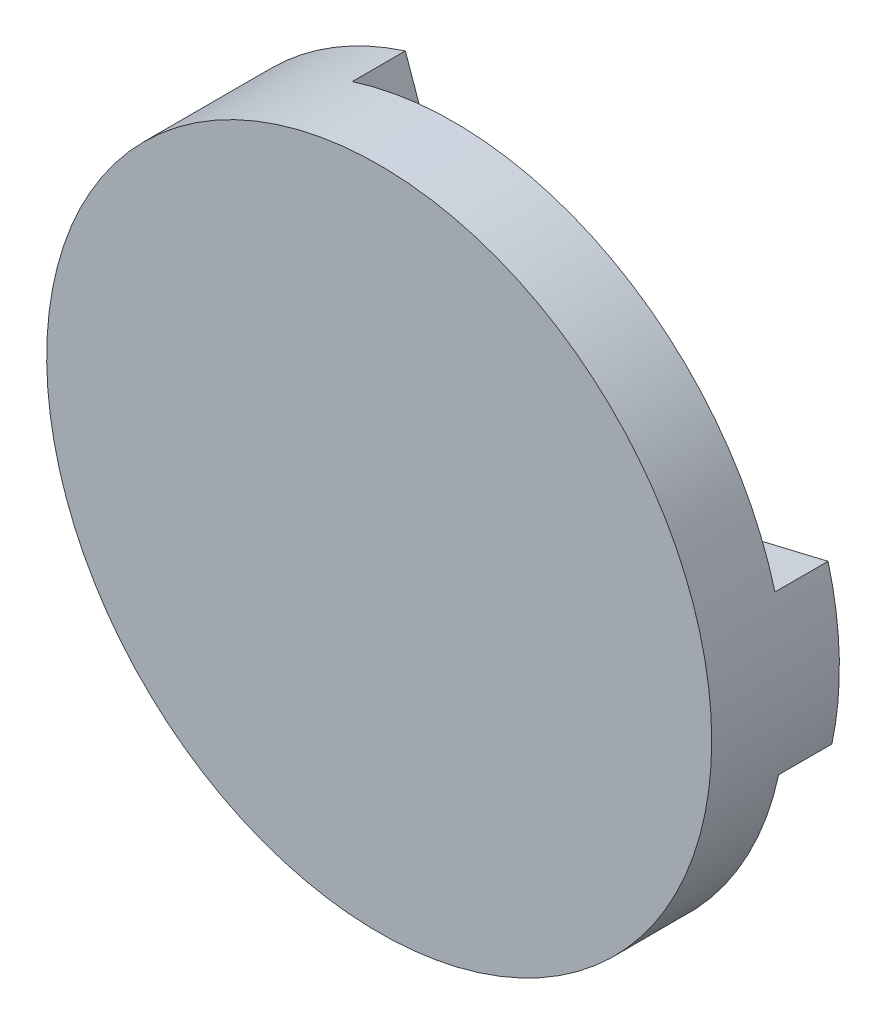
ISO-10303-21;
HEADER;
FILE_DESCRIPTION(('STEP AP214'),'2;1');
FILE_NAME('part.step','',(''),(''),'','','');
FILE_SCHEMA(('AUTOMOTIVE_DESIGN { 1 0 10303 214 1 1 1 1 }'));
ENDSEC;
DATA;
#1=APPLICATION_CONTEXT('core data for automotive mechanical design processes');
#2=APPLICATION_PROTOCOL_DEFINITION('international standard','automotive_design',2000,#1);
#3=PRODUCT_CONTEXT('',#1,'mechanical');
#4=PRODUCT('Part','Part','',(#3));
#5=PRODUCT_RELATED_PRODUCT_CATEGORY('part','',(#4));
#6=PRODUCT_DEFINITION_FORMATION('','',#4);
#7=PRODUCT_DEFINITION_CONTEXT('part definition',#1,'design');
#8=PRODUCT_DEFINITION('design','',#6,#7);
#9=PRODUCT_DEFINITION_SHAPE('','',#8);
#10=(LENGTH_UNIT() NAMED_UNIT(*) SI_UNIT(.MILLI.,.METRE.));
#11=(NAMED_UNIT(*) PLANE_ANGLE_UNIT() SI_UNIT($,.RADIAN.));
#12=(NAMED_UNIT(*) SI_UNIT($,.STERADIAN.) SOLID_ANGLE_UNIT());
#13=UNCERTAINTY_MEASURE_WITH_UNIT(LENGTH_MEASURE(1.E-05),#10,'distance_accuracy_value','');
#14=(GEOMETRIC_REPRESENTATION_CONTEXT(3) GLOBAL_UNCERTAINTY_ASSIGNED_CONTEXT((#13)) GLOBAL_UNIT_ASSIGNED_CONTEXT((#10,
#11,#12)) REPRESENTATION_CONTEXT('',''));
#15=CARTESIAN_POINT('',(0.,0.,0.));
#16=DIRECTION('',(0.,0.,1.));
#17=DIRECTION('',(1.,0.,0.));
#18=AXIS2_PLACEMENT_3D('',#15,#16,#17);
#19=CARTESIAN_POINT('',(-49.5057986834796,-44.6279443938459,12.7));
#20=DIRECTION('',(0.,0.,1.));
#21=DIRECTION('',(1.,0.,0.));
#22=AXIS2_PLACEMENT_3D('',#19,#20,#21);
#23=PLANE('',#22);
#24=CARTESIAN_POINT('',(-49.5057986834796,-44.6279443938459,12.7));
#25=DIRECTION('',(0.,0.,1.));
#26=DIRECTION('',(-1.,0.,0.));
#27=AXIS2_PLACEMENT_3D('',#24,#25,#26);
#28=CIRCLE('',#27,35.1808297096941);
#29=CARTESIAN_POINT('',(-58.6049963833806,-78.611696103753,12.7));
#30=VERTEX_POINT('',#29);
#31=CARTESIAN_POINT('',(-15.1256173713138,-52.0907797802859,12.7));
#32=VERTEX_POINT('',#31);
#33=EDGE_CURVE('E240',#30,#32,#28,.T.);
#34=ORIENTED_EDGE('',*,*,#33,.F.);
#35=DIRECTION('',(0.285993671395567,0.958231506433432,0.));
#36=VECTOR('',#35,1.);
#37=CARTESIAN_POINT('',(-58.7480502112232,-79.0910028110861,12.7));
#38=LINE('',#37,#36);
#39=CARTESIAN_POINT('',(-51.6290126964686,-55.2384259032424,12.7));
#40=VERTEX_POINT('',#39);
#41=EDGE_CURVE('E343',#30,#40,#38,.T.);
#42=ORIENTED_EDGE('',*,*,#41,.T.);
#43=CARTESIAN_POINT('',(-49.5057986834796,-44.6279443938459,12.7));
#44=DIRECTION('',(0.,0.,1.));
#45=DIRECTION('',(1.,0.,0.));
#46=AXIS2_PLACEMENT_3D('',#43,#44,#45);
#47=CIRCLE('',#46,10.8208297096941);
#48=CARTESIAN_POINT('',(-57.2792506996545,-52.1554804687129,12.7));
#49=VERTEX_POINT('',#48);
#50=EDGE_CURVE('E353',#49,#40,#47,.T.);
#51=ORIENTED_EDGE('',*,*,#50,.F.);
#52=DIRECTION('',(-0.651016085634153,-0.759063934227931,0.));
#53=VECTOR('',#52,1.);
#54=CARTESIAN_POINT('',(-57.2792506996545,-52.1554804687129,12.7));
#55=LINE('',#54,#53);
#56=CARTESIAN_POINT('',(-73.1588943684811,-70.6706371036764,12.7));
#57=VERTEX_POINT('',#56);
#58=EDGE_CURVE('E338',#49,#57,#55,.T.);
#59=ORIENTED_EDGE('',*,*,#58,.T.);
#60=CARTESIAN_POINT('',(-49.5057986834796,-44.6279443938459,12.7));
#61=DIRECTION('',(0.,0.,1.));
#62=DIRECTION('',(-1.,0.,0.));
#63=AXIS2_PLACEMENT_3D('',#60,#61,#62);
#64=CIRCLE('',#63,35.1808297096941);
#65=CARTESIAN_POINT('',(-74.3869921302117,-19.7559321767214,12.7));
#66=VERTEX_POINT('',#65);
#67=EDGE_CURVE('E290',#66,#57,#64,.T.);
#68=ORIENTED_EDGE('',*,*,#67,.F.);
#69=DIRECTION('',(0.686855991580207,-0.72679353796685,0.));
#70=VECTOR('',#69,1.);
#71=CARTESIAN_POINT('',(-74.7305570010451,-19.3923905740346,12.7));
#72=LINE('',#71,#70);
#73=CARTESIAN_POINT('',(-57.6331382105075,-37.4839463662281,12.7));
#74=VERTEX_POINT('',#73);
#75=EDGE_CURVE('E456',#66,#74,#72,.T.);
#76=ORIENTED_EDGE('',*,*,#75,.T.);
#77=CARTESIAN_POINT('',(-49.5057986834796,-44.6279443938459,12.7));
#78=DIRECTION('',(0.,0.,1.));
#79=DIRECTION('',(1.,0.,0.));
#80=AXIS2_PLACEMENT_3D('',#77,#78,#79);
#81=CIRCLE('',#80,10.8208297096941);
#82=CARTESIAN_POINT('',(-52.1381101441308,-34.1321694353056,12.7));
#83=VERTEX_POINT('',#82);
#84=EDGE_CURVE('E444',#83,#74,#81,.T.);
#85=ORIENTED_EDGE('',*,*,#84,.F.);
#86=DIRECTION('',(-0.331860607320881,0.943328435545445,0.));
#87=VECTOR('',#86,1.);
#88=CARTESIAN_POINT('',(-52.1381101441308,-34.1321694353056,12.7));
#89=LINE('',#88,#87);
#90=CARTESIAN_POINT('',(-60.2328843106441,-11.1224162975754,12.7));
#91=VERTEX_POINT('',#90);
#92=EDGE_CURVE('E434',#83,#91,#89,.T.);
#93=ORIENTED_EDGE('',*,*,#92,.T.);
#94=CARTESIAN_POINT('',(-49.5057986834796,-44.6279443938459,12.7));
#95=DIRECTION('',(0.,0.,1.));
#96=DIRECTION('',(-1.,0.,0.));
#97=AXIS2_PLACEMENT_3D('',#94,#95,#96);
#98=CIRCLE('',#97,35.1808297096941);
#99=CARTESIAN_POINT('',(-15.5254075368467,-35.5162049010634,12.7));
#100=VERTEX_POINT('',#99);
#101=EDGE_CURVE('E350',#100,#91,#98,.T.);
#102=ORIENTED_EDGE('',*,*,#101,.F.);
#103=DIRECTION('',(-0.972849662975767,-0.231437968466579,0.));
#104=VECTOR('',#103,1.);
#105=CARTESIAN_POINT('',(-15.0387888381707,-35.4004397964172,12.7));
#106=LINE('',#105,#104);
#107=CARTESIAN_POINT('',(-39.2552451434626,-41.1614609120673,12.7));
#108=VERTEX_POINT('',#107);
#109=EDGE_CURVE('E466',#100,#108,#106,.T.);
#110=ORIENTED_EDGE('',*,*,#109,.T.);
#111=CARTESIAN_POINT('',(-49.5057986834796,-44.6279443938459,12.7));
#112=DIRECTION('',(0.,0.,1.));
#113=DIRECTION('',(1.,0.,0.));
#114=AXIS2_PLACEMENT_3D('',#111,#112,#113);
#115=CIRCLE('',#114,10.8208297096941);
#116=CARTESIAN_POINT('',(-39.1000352066535,-47.5961832775193,12.7));
#117=VERTEX_POINT('',#116);
#118=EDGE_CURVE('E463',#117,#108,#115,.T.);
#119=ORIENTED_EDGE('',*,*,#118,.F.);
#120=DIRECTION('',(0.982876692955026,-0.184264501317512,0.));
#121=VECTOR('',#120,1.);
#122=CARTESIAN_POINT('',(-39.1000352066535,-47.5961832775193,12.7));
#123=LINE('',#122,#121);
#124=EDGE_CURVE('E266',#117,#32,#123,.T.);
#125=ORIENTED_EDGE('',*,*,#124,.T.);
#126=EDGE_LOOP('',(#34,#42,#51,#59,#68,#76,#85,#93,#102,#110,#119,#125));
#127=FACE_BOUND('',#126,.T.);
#128=ADVANCED_FACE('F37',(#127),#23,.F.);
#129=CARTESIAN_POINT('',(-39.1000352066535,-47.5961832775193,12.7));
#130=DIRECTION('',(0.184264501317512,0.982876692955026,0.));
#131=DIRECTION('',(-0.982876692955026,0.184264501317512,0.));
#132=AXIS2_PLACEMENT_3D('',#129,#130,#131);
#133=PLANE('',#132);
#134=DIRECTION('',(0.,0.,1.));
#135=VECTOR('',#134,1.);
#136=CARTESIAN_POINT('',(-15.1256173713138,-52.0907797802859,5.7));
#137=LINE('',#136,#135);
#138=CARTESIAN_POINT('',(-15.1256173713138,-52.0907797802859,5.7));
#139=VERTEX_POINT('',#138);
#140=EDGE_CURVE('E239',#32,#139,#137,.F.);
#141=ORIENTED_EDGE('',*,*,#140,.F.);
#142=ORIENTED_EDGE('',*,*,#124,.F.);
#143=DIRECTION('',(0.,0.,-1.));
#144=VECTOR('',#143,1.);
#145=CARTESIAN_POINT('',(-39.1000352066535,-47.5961832775193,12.7));
#146=LINE('',#145,#144);
#147=CARTESIAN_POINT('',(-39.1000352066535,-47.5961832775193,0.));
#148=VERTEX_POINT('',#147);
#149=EDGE_CURVE('E256',#117,#148,#146,.T.);
#150=ORIENTED_EDGE('',*,*,#149,.T.);
#151=DIRECTION('',(0.982876692955026,-0.184264501317512,0.));
#152=VECTOR('',#151,1.);
#153=CARTESIAN_POINT('',(-39.1000352066535,-47.5961832775193,0.));
#154=LINE('',#153,#152);
#155=CARTESIAN_POINT('',(-14.6339831594852,-52.1829487507403,0.));
#156=VERTEX_POINT('',#155);
#157=EDGE_CURVE('E254',#148,#156,#154,.T.);
#158=ORIENTED_EDGE('',*,*,#157,.T.);
#159=DIRECTION('',(0.,0.,-1.));
#160=VECTOR('',#159,1.);
#161=CARTESIAN_POINT('',(-14.6339831594852,-52.1829487507403,12.7));
#162=LINE('',#161,#160);
#163=CARTESIAN_POINT('',(-14.6339831594852,-52.1829487507403,5.7));
#164=VERTEX_POINT('',#163);
#165=EDGE_CURVE('E247',#164,#156,#162,.T.);
#166=ORIENTED_EDGE('',*,*,#165,.F.);
#167=DIRECTION('',(-0.982876692955026,0.184264501317512,0.));
#168=VECTOR('',#167,1.);
#169=CARTESIAN_POINT('',(-39.1000352066535,-47.5961832775193,5.7));
#170=LINE('',#169,#168);
#171=EDGE_CURVE('E232',#164,#139,#170,.T.);
#172=ORIENTED_EDGE('',*,*,#171,.T.);
#173=EDGE_LOOP('',(#141,#142,#150,#158,#166,#172));
#174=FACE_BOUND('',#173,.T.);
#175=ADVANCED_FACE('F252',(#174),#133,.F.);
#176=CARTESIAN_POINT('',(-58.7480502112232,-79.0910028110861,12.7));
#177=DIRECTION('',(-0.958231506433432,0.285993671395567,0.));
#178=DIRECTION('',(-0.285993671395567,-0.958231506433432,0.));
#179=AXIS2_PLACEMENT_3D('',#176,#177,#178);
#180=PLANE('',#179);
#181=DIRECTION('',(0.,0.,1.));
#182=VECTOR('',#181,1.);
#183=CARTESIAN_POINT('',(-58.6049963833806,-78.611696103753,5.7));
#184=LINE('',#183,#182);
#185=CARTESIAN_POINT('',(-58.6049963833806,-78.611696103753,5.7));
#186=VERTEX_POINT('',#185);
#187=EDGE_CURVE('E11',#186,#30,#184,.T.);
#188=ORIENTED_EDGE('',*,*,#187,.F.);
#189=DIRECTION('',(-0.285993671395567,-0.958231506433432,0.));
#190=VECTOR('',#189,1.);
#191=CARTESIAN_POINT('',(-58.7480502112232,-79.0910028110861,5.7));
#192=LINE('',#191,#190);
#193=CARTESIAN_POINT('',(-58.7480502112232,-79.0910028110861,5.7));
#194=VERTEX_POINT('',#193);
#195=EDGE_CURVE('E45',#186,#194,#192,.T.);
#196=ORIENTED_EDGE('',*,*,#195,.T.);
#197=DIRECTION('',(0.,0.,-1.));
#198=VECTOR('',#197,1.);
#199=CARTESIAN_POINT('',(-58.7480502112232,-79.0910028110861,12.7));
#200=LINE('',#199,#198);
#201=CARTESIAN_POINT('',(-58.7480502112232,-79.0910028110861,0.));
#202=VERTEX_POINT('',#201);
#203=EDGE_CURVE('E250',#194,#202,#200,.T.);
#204=ORIENTED_EDGE('',*,*,#203,.T.);
#205=DIRECTION('',(0.285993671395567,0.958231506433432,0.));
#206=VECTOR('',#205,1.);
#207=CARTESIAN_POINT('',(-58.7480502112232,-79.0910028110861,0.));
#208=LINE('',#207,#206);
#209=CARTESIAN_POINT('',(-51.6290126964686,-55.2384259032424,0.));
#210=VERTEX_POINT('',#209);
#211=EDGE_CURVE('E346',#202,#210,#208,.T.);
#212=ORIENTED_EDGE('',*,*,#211,.T.);
#213=DIRECTION('',(0.,0.,-1.));
#214=VECTOR('',#213,1.);
#215=CARTESIAN_POINT('',(-51.6290126964686,-55.2384259032424,12.7));
#216=LINE('',#215,#214);
#217=EDGE_CURVE('E332',#40,#210,#216,.T.);
#218=ORIENTED_EDGE('',*,*,#217,.F.);
#219=ORIENTED_EDGE('',*,*,#41,.F.);
#220=EDGE_LOOP('',(#188,#196,#204,#212,#218,#219));
#221=FACE_BOUND('',#220,.T.);
#222=ADVANCED_FACE('F278',(#221),#180,.F.);
#223=CARTESIAN_POINT('',(-74.7305570010451,-19.3923905740346,12.7));
#224=DIRECTION('',(0.72679353796685,0.686855991580207,0.));
#225=DIRECTION('',(-0.686855991580207,0.72679353796685,0.));
#226=AXIS2_PLACEMENT_3D('',#223,#224,#225);
#227=PLANE('',#226);
#228=DIRECTION('',(0.,0.,1.));
#229=VECTOR('',#228,1.);
#230=CARTESIAN_POINT('',(-74.3869921302117,-19.7559321767214,5.7));
#231=LINE('',#230,#229);
#232=CARTESIAN_POINT('',(-74.3869921302117,-19.7559321767214,5.7));
#233=VERTEX_POINT('',#232);
#234=EDGE_CURVE('E297',#233,#66,#231,.T.);
#235=ORIENTED_EDGE('',*,*,#234,.F.);
#236=DIRECTION('',(-0.686855991580207,0.72679353796685,0.));
#237=VECTOR('',#236,1.);
#238=CARTESIAN_POINT('',(-74.7305570010451,-19.3923905740346,5.7));
#239=LINE('',#238,#237);
#240=CARTESIAN_POINT('',(-74.7305570010451,-19.3923905740345,5.7));
#241=VERTEX_POINT('',#240);
#242=EDGE_CURVE('E292',#233,#241,#239,.T.);
#243=ORIENTED_EDGE('',*,*,#242,.T.);
#244=DIRECTION('',(0.,0.,-1.));
#245=VECTOR('',#244,1.);
#246=CARTESIAN_POINT('',(-74.7305570010451,-19.3923905740346,12.7));
#247=LINE('',#246,#245);
#248=CARTESIAN_POINT('',(-74.7305570010451,-19.3923905740346,0.));
#249=VERTEX_POINT('',#248);
#250=EDGE_CURVE('E435',#241,#249,#247,.T.);
#251=ORIENTED_EDGE('',*,*,#250,.T.);
#252=DIRECTION('',(0.686855991580207,-0.72679353796685,0.));
#253=VECTOR('',#252,1.);
#254=CARTESIAN_POINT('',(-74.7305570010451,-19.3923905740346,0.));
#255=LINE('',#254,#253);
#256=CARTESIAN_POINT('',(-57.6331382105075,-37.4839463662281,0.));
#257=VERTEX_POINT('',#256);
#258=EDGE_CURVE('E447',#249,#257,#255,.T.);
#259=ORIENTED_EDGE('',*,*,#258,.T.);
#260=DIRECTION('',(0.,0.,-1.));
#261=VECTOR('',#260,1.);
#262=CARTESIAN_POINT('',(-57.6331382105075,-37.4839463662281,12.7));
#263=LINE('',#262,#261);
#264=EDGE_CURVE('E432',#74,#257,#263,.T.);
#265=ORIENTED_EDGE('',*,*,#264,.F.);
#266=ORIENTED_EDGE('',*,*,#75,.F.);
#267=EDGE_LOOP('',(#235,#243,#251,#259,#265,#266));
#268=FACE_BOUND('',#267,.T.);
#269=ADVANCED_FACE('F509',(#268),#227,.F.);
#270=CARTESIAN_POINT('',(-57.2792506996545,-52.1554804687129,12.7));
#271=DIRECTION('',(0.759063934227931,-0.651016085634153,0.));
#272=DIRECTION('',(0.651016085634153,0.759063934227931,0.));
#273=AXIS2_PLACEMENT_3D('',#270,#271,#272);
#274=PLANE('',#273);
#275=DIRECTION('',(0.,0.,1.));
#276=VECTOR('',#275,1.);
#277=CARTESIAN_POINT('',(-73.1588943684811,-70.6706371036764,5.7));
#278=LINE('',#277,#276);
#279=CARTESIAN_POINT('',(-73.1588943684811,-70.6706371036764,5.7));
#280=VERTEX_POINT('',#279);
#281=EDGE_CURVE('E275',#57,#280,#278,.F.);
#282=ORIENTED_EDGE('',*,*,#281,.F.);
#283=ORIENTED_EDGE('',*,*,#58,.F.);
#284=DIRECTION('',(0.,0.,-1.));
#285=VECTOR('',#284,1.);
#286=CARTESIAN_POINT('',(-57.2792506996545,-52.1554804687129,12.7));
#287=LINE('',#286,#285);
#288=CARTESIAN_POINT('',(-57.2792506996545,-52.1554804687129,0.));
#289=VERTEX_POINT('',#288);
#290=EDGE_CURVE('E334',#49,#289,#287,.T.);
#291=ORIENTED_EDGE('',*,*,#290,.T.);
#292=DIRECTION('',(-0.651016085634153,-0.759063934227931,0.));
#293=VECTOR('',#292,1.);
#294=CARTESIAN_POINT('',(-57.2792506996545,-52.1554804687129,0.));
#295=LINE('',#294,#293);
#296=CARTESIAN_POINT('',(-73.4845321442495,-71.0503203352623,0.));
#297=VERTEX_POINT('',#296);
#298=EDGE_CURVE('E339',#289,#297,#295,.T.);
#299=ORIENTED_EDGE('',*,*,#298,.T.);
#300=DIRECTION('',(0.,0.,-1.));
#301=VECTOR('',#300,1.);
#302=CARTESIAN_POINT('',(-73.4845321442495,-71.0503203352623,12.7));
#303=LINE('',#302,#301);
#304=CARTESIAN_POINT('',(-73.4845321442495,-71.0503203352623,5.7));
#305=VERTEX_POINT('',#304);
#306=EDGE_CURVE('E336',#305,#297,#303,.T.);
#307=ORIENTED_EDGE('',*,*,#306,.F.);
#308=DIRECTION('',(0.651016085634153,0.759063934227931,0.));
#309=VECTOR('',#308,1.);
#310=CARTESIAN_POINT('',(-57.2792506996545,-52.1554804687129,5.7));
#311=LINE('',#310,#309);
#312=EDGE_CURVE('E272',#305,#280,#311,.T.);
#313=ORIENTED_EDGE('',*,*,#312,.T.);
#314=EDGE_LOOP('',(#282,#283,#291,#299,#307,#313));
#315=FACE_BOUND('',#314,.T.);
#316=ADVANCED_FACE('F515',(#315),#274,.F.);
#317=CARTESIAN_POINT('',(-15.0387888381707,-35.4004397964172,12.7));
#318=DIRECTION('',(0.231437968466579,-0.972849662975767,0.));
#319=DIRECTION('',(0.972849662975767,0.231437968466579,0.));
#320=AXIS2_PLACEMENT_3D('',#317,#318,#319);
#321=PLANE('',#320);
#322=DIRECTION('',(0.,0.,1.));
#323=VECTOR('',#322,1.);
#324=CARTESIAN_POINT('',(-15.5254075368467,-35.5162049010634,5.7));
#325=LINE('',#324,#323);
#326=CARTESIAN_POINT('',(-15.5254075368467,-35.5162049010634,5.7));
#327=VERTEX_POINT('',#326);
#328=EDGE_CURVE('E365',#327,#100,#325,.T.);
#329=ORIENTED_EDGE('',*,*,#328,.F.);
#330=DIRECTION('',(0.972849662975767,0.231437968466579,0.));
#331=VECTOR('',#330,1.);
#332=CARTESIAN_POINT('',(-15.0387888381707,-35.4004397964172,5.7));
#333=LINE('',#332,#331);
#334=CARTESIAN_POINT('',(-15.0387888381707,-35.4004397964172,5.7));
#335=VERTEX_POINT('',#334);
#336=EDGE_CURVE('E361',#327,#335,#333,.T.);
#337=ORIENTED_EDGE('',*,*,#336,.T.);
#338=DIRECTION('',(0.,0.,-1.));
#339=VECTOR('',#338,1.);
#340=CARTESIAN_POINT('',(-15.0387888381707,-35.4004397964172,12.7));
#341=LINE('',#340,#339);
#342=CARTESIAN_POINT('',(-15.0387888381707,-35.4004397964172,0.));
#343=VERTEX_POINT('',#342);
#344=EDGE_CURVE('E257',#335,#343,#341,.T.);
#345=ORIENTED_EDGE('',*,*,#344,.T.);
#346=DIRECTION('',(-0.972849662975767,-0.231437968466579,0.));
#347=VECTOR('',#346,1.);
#348=CARTESIAN_POINT('',(-15.0387888381707,-35.4004397964172,0.));
#349=LINE('',#348,#347);
#350=CARTESIAN_POINT('',(-39.2552451434626,-41.1614609120673,0.));
#351=VERTEX_POINT('',#350);
#352=EDGE_CURVE('E472',#343,#351,#349,.T.);
#353=ORIENTED_EDGE('',*,*,#352,.T.);
#354=DIRECTION('',(0.,0.,-1.));
#355=VECTOR('',#354,1.);
#356=CARTESIAN_POINT('',(-39.2552451434626,-41.1614609120673,12.7));
#357=LINE('',#356,#355);
#358=EDGE_CURVE('E261',#108,#351,#357,.T.);
#359=ORIENTED_EDGE('',*,*,#358,.F.);
#360=ORIENTED_EDGE('',*,*,#109,.F.);
#361=EDGE_LOOP('',(#329,#337,#345,#353,#359,#360));
#362=FACE_BOUND('',#361,.T.);
#363=ADVANCED_FACE('F485',(#362),#321,.F.);
#364=CARTESIAN_POINT('',(-52.1381101441308,-34.1321694353056,12.7));
#365=DIRECTION('',(-0.943328435545445,-0.331860607320881,0.));
#366=DIRECTION('',(0.331860607320881,-0.943328435545445,0.));
#367=AXIS2_PLACEMENT_3D('',#364,#365,#366);
#368=PLANE('',#367);
#369=DIRECTION('',(0.,0.,1.));
#370=VECTOR('',#369,1.);
#371=CARTESIAN_POINT('',(-60.2328843106441,-11.1224162975754,5.7));
#372=LINE('',#371,#370);
#373=CARTESIAN_POINT('',(-60.2328843106441,-11.1224162975754,5.7));
#374=VERTEX_POINT('',#373);
#375=EDGE_CURVE('E269',#91,#374,#372,.F.);
#376=ORIENTED_EDGE('',*,*,#375,.F.);
#377=ORIENTED_EDGE('',*,*,#92,.F.);
#378=DIRECTION('',(0.,0.,-1.));
#379=VECTOR('',#378,1.);
#380=CARTESIAN_POINT('',(-52.1381101441308,-34.1321694353056,12.7));
#381=LINE('',#380,#379);
#382=CARTESIAN_POINT('',(-52.1381101441308,-34.1321694353056,0.));
#383=VERTEX_POINT('',#382);
#384=EDGE_CURVE('E391',#83,#383,#381,.T.);
#385=ORIENTED_EDGE('',*,*,#384,.T.);
#386=DIRECTION('',(-0.331860607320881,0.943328435545445,0.));
#387=VECTOR('',#386,1.);
#388=CARTESIAN_POINT('',(-52.1381101441308,-34.1321694353056,0.));
#389=LINE('',#388,#387);
#390=CARTESIAN_POINT('',(-60.3988807467043,-10.6505640955351,0.));
#391=VERTEX_POINT('',#390);
#392=EDGE_CURVE('E440',#383,#391,#389,.T.);
#393=ORIENTED_EDGE('',*,*,#392,.T.);
#394=DIRECTION('',(0.,0.,-1.));
#395=VECTOR('',#394,1.);
#396=CARTESIAN_POINT('',(-60.3988807467043,-10.6505640955351,12.7));
#397=LINE('',#396,#395);
#398=CARTESIAN_POINT('',(-60.3988807467043,-10.6505640955351,5.7));
#399=VERTEX_POINT('',#398);
#400=EDGE_CURVE('E437',#399,#391,#397,.T.);
#401=ORIENTED_EDGE('',*,*,#400,.F.);
#402=DIRECTION('',(0.331860607320881,-0.943328435545445,0.));
#403=VECTOR('',#402,1.);
#404=CARTESIAN_POINT('',(-52.1381101441308,-34.1321694353056,5.7));
#405=LINE('',#404,#403);
#406=EDGE_CURVE('E259',#399,#374,#405,.T.);
#407=ORIENTED_EDGE('',*,*,#406,.T.);
#408=EDGE_LOOP('',(#376,#377,#385,#393,#401,#407));
#409=FACE_BOUND('',#408,.T.);
#410=ADVANCED_FACE('F497',(#409),#368,.F.);
#411=CARTESIAN_POINT('',(-49.5057986834796,-44.6279443938459,12.7));
#412=DIRECTION('',(0.,0.,-1.));
#413=DIRECTION('',(-1.,0.,0.));
#414=AXIS2_PLACEMENT_3D('',#411,#412,#413);
#415=CYLINDRICAL_SURFACE('',#414,10.8208297096941);
#416=CARTESIAN_POINT('',(-49.5057986834796,-44.6279443938459,0.));
#417=DIRECTION('',(0.,0.,1.));
#418=DIRECTION('',(1.,0.,0.));
#419=AXIS2_PLACEMENT_3D('',#416,#417,#418);
#420=CIRCLE('',#419,10.8208297096941);
#421=EDGE_CURVE('E462',#148,#351,#420,.T.);
#422=ORIENTED_EDGE('',*,*,#421,.F.);
#423=ORIENTED_EDGE('',*,*,#149,.F.);
#424=ORIENTED_EDGE('',*,*,#118,.T.);
#425=ORIENTED_EDGE('',*,*,#358,.T.);
#426=EDGE_LOOP('',(#422,#423,#424,#425));
#427=FACE_BOUND('',#426,.T.);
#428=ADVANCED_FACE('F39',(#427),#415,.F.);
#429=CARTESIAN_POINT('',(-49.5057986834796,-44.6279443938459,12.7));
#430=DIRECTION('',(0.,0.,-1.));
#431=DIRECTION('',(-1.,0.,0.));
#432=AXIS2_PLACEMENT_3D('',#429,#430,#431);
#433=CYLINDRICAL_SURFACE('',#432,35.6808297096941);
#434=CARTESIAN_POINT('',(-49.5057986834796,-44.6279443938459,5.7));
#435=DIRECTION('',(0.,0.,-1.));
#436=DIRECTION('',(-1.,0.,0.));
#437=AXIS2_PLACEMENT_3D('',#434,#435,#436);
#438=CIRCLE('',#437,35.6808297096941);
#439=EDGE_CURVE('E52',#164,#194,#438,.T.);
#440=ORIENTED_EDGE('',*,*,#439,.F.);
#441=ORIENTED_EDGE('',*,*,#165,.T.);
#442=CARTESIAN_POINT('',(-49.5057986834796,-44.6279443938459,0.));
#443=DIRECTION('',(0.,0.,1.));
#444=DIRECTION('',(1.,0.,0.));
#445=AXIS2_PLACEMENT_3D('',#442,#443,#444);
#446=CIRCLE('',#445,35.6808297096941);
#447=EDGE_CURVE('E475',#156,#343,#446,.T.);
#448=ORIENTED_EDGE('',*,*,#447,.T.);
#449=ORIENTED_EDGE('',*,*,#344,.F.);
#450=CARTESIAN_POINT('',(-49.5057986834796,-44.6279443938459,5.7));
#451=DIRECTION('',(0.,0.,-1.));
#452=DIRECTION('',(-1.,0.,0.));
#453=AXIS2_PLACEMENT_3D('',#450,#451,#452);
#454=CIRCLE('',#453,35.6808297096941);
#455=EDGE_CURVE('E357',#399,#335,#454,.T.);
#456=ORIENTED_EDGE('',*,*,#455,.F.);
#457=ORIENTED_EDGE('',*,*,#400,.T.);
#458=CARTESIAN_POINT('',(-49.5057986834796,-44.6279443938459,0.));
#459=DIRECTION('',(0.,0.,1.));
#460=DIRECTION('',(1.,0.,0.));
#461=AXIS2_PLACEMENT_3D('',#458,#459,#460);
#462=CIRCLE('',#461,35.6808297096941);
#463=EDGE_CURVE('E443',#391,#249,#462,.T.);
#464=ORIENTED_EDGE('',*,*,#463,.T.);
#465=ORIENTED_EDGE('',*,*,#250,.F.);
#466=CARTESIAN_POINT('',(-49.5057986834796,-44.6279443938459,5.7));
#467=DIRECTION('',(0.,0.,-1.));
#468=DIRECTION('',(-1.,0.,0.));
#469=AXIS2_PLACEMENT_3D('',#466,#467,#468);
#470=CIRCLE('',#469,35.6808297096941);
#471=EDGE_CURVE('E289',#305,#241,#470,.T.);
#472=ORIENTED_EDGE('',*,*,#471,.F.);
#473=ORIENTED_EDGE('',*,*,#306,.T.);
#474=CARTESIAN_POINT('',(-49.5057986834796,-44.6279443938459,0.));
#475=DIRECTION('',(0.,0.,1.));
#476=DIRECTION('',(1.,0.,0.));
#477=AXIS2_PLACEMENT_3D('',#474,#475,#476);
#478=CIRCLE('',#477,35.6808297096941);
#479=EDGE_CURVE('E348',#297,#202,#478,.T.);
#480=ORIENTED_EDGE('',*,*,#479,.T.);
#481=ORIENTED_EDGE('',*,*,#203,.F.);
#482=EDGE_LOOP('',(#440,#441,#448,#449,#456,#457,#464,#465,#472,#473,#480,#481));
#483=FACE_BOUND('',#482,.T.);
#484=CARTESIAN_POINT('',(-49.5057986834796,-44.6279443938459,13.7));
#485=DIRECTION('',(0.,0.,1.));
#486=DIRECTION('',(1.,0.,0.));
#487=AXIS2_PLACEMENT_3D('',#484,#485,#486);
#488=CIRCLE('',#487,35.6808297096941);
#489=CARTESIAN_POINT('',(-13.8249689737855,-44.6279443938459,13.7));
#490=VERTEX_POINT('',#489);
#491=EDGE_CURVE('E453',#490,#490,#488,.T.);
#492=ORIENTED_EDGE('',*,*,#491,.F.);
#493=EDGE_LOOP('',(#492));
#494=FACE_BOUND('',#493,.T.);
#495=ADVANCED_FACE('F244',(#483,#494),#433,.T.);
#496=CARTESIAN_POINT('',(-49.5057986834796,-44.6279443938459,0.));
#497=DIRECTION('',(0.,0.,1.));
#498=DIRECTION('',(1.,0.,0.));
#499=AXIS2_PLACEMENT_3D('',#496,#497,#498);
#500=PLANE('',#499);
#501=DIRECTION('',(0.972849662975766,0.23143796846658,0.));
#502=VECTOR('',#501,1.);
#503=CARTESIAN_POINT('',(-38.6187993541123,-41.5240064243871,0.));
#504=LINE('',#503,#502);
#505=CARTESIAN_POINT('',(-38.6187993541123,-41.5240064243871,0.));
#506=VERTEX_POINT('',#505);
#507=CARTESIAN_POINT('',(-15.3993161203134,-36.0001621625342,0.));
#508=VERTEX_POINT('',#507);
#509=EDGE_CURVE('E386',#506,#508,#504,.T.);
#510=ORIENTED_EDGE('',*,*,#509,.F.);
#511=CARTESIAN_POINT('',(-49.5057986834796,-44.6279443938459,0.));
#512=DIRECTION('',(0.,0.,1.));
#513=DIRECTION('',(-1.,0.,0.));
#514=AXIS2_PLACEMENT_3D('',#511,#512,#513);
#515=CIRCLE('',#514,11.3208297096941);
#516=CARTESIAN_POINT('',(-38.4818090900824,-47.2033742143928,0.));
#517=VERTEX_POINT('',#516);
#518=EDGE_CURVE('E389',#517,#506,#515,.T.);
#519=ORIENTED_EDGE('',*,*,#518,.F.);
#520=DIRECTION('',(-0.982876692955026,0.184264501317512,0.));
#521=VECTOR('',#520,1.);
#522=CARTESIAN_POINT('',(-15.0230057810973,-51.6013060447221,0.));
#523=LINE('',#522,#521);
#524=CARTESIAN_POINT('',(-15.0230057810973,-51.6013060447221,0.));
#525=VERTEX_POINT('',#524);
#526=EDGE_CURVE('E379',#525,#517,#523,.T.);
#527=ORIENTED_EDGE('',*,*,#526,.F.);
#528=CARTESIAN_POINT('',(-49.5057986834796,-44.6279443938459,0.));
#529=DIRECTION('',(0.,0.,-1.));
#530=DIRECTION('',(-1.,0.,0.));
#531=AXIS2_PLACEMENT_3D('',#528,#529,#530);
#532=CIRCLE('',#531,35.1808297096941);
#533=EDGE_CURVE('E382',#508,#525,#532,.T.);
#534=ORIENTED_EDGE('',*,*,#533,.F.);
#535=EDGE_LOOP('',(#510,#519,#527,#534));
#536=FACE_BOUND('',#535,.T.);
#537=ORIENTED_EDGE('',*,*,#421,.T.);
#538=ORIENTED_EDGE('',*,*,#352,.F.);
#539=ORIENTED_EDGE('',*,*,#447,.F.);
#540=ORIENTED_EDGE('',*,*,#157,.F.);
#541=EDGE_LOOP('',(#537,#538,#539,#540));
#542=FACE_BOUND('',#541,.T.);
#543=ADVANCED_FACE('F480',(#536,#542),#500,.F.);
#544=CARTESIAN_POINT('',(-49.5057986834796,-44.6279443938459,13.7));
#545=DIRECTION('',(0.,0.,1.));
#546=DIRECTION('',(1.,0.,0.));
#547=AXIS2_PLACEMENT_3D('',#544,#545,#546);
#548=PLANE('',#547);
#549=ORIENTED_EDGE('',*,*,#491,.T.);
#550=EDGE_LOOP('',(#549));
#551=FACE_BOUND('',#550,.T.);
#552=ADVANCED_FACE('F546',(#551),#548,.T.);
#553=CARTESIAN_POINT('',(-49.5057986834796,-44.6279443938459,12.7));
#554=DIRECTION('',(0.,0.,-1.));
#555=DIRECTION('',(-1.,0.,0.));
#556=AXIS2_PLACEMENT_3D('',#553,#554,#555);
#557=CYLINDRICAL_SURFACE('',#556,10.8208297096941);
#558=CARTESIAN_POINT('',(-49.5057986834796,-44.6279443938459,0.));
#559=DIRECTION('',(0.,0.,1.));
#560=DIRECTION('',(1.,0.,0.));
#561=AXIS2_PLACEMENT_3D('',#558,#559,#560);
#562=CIRCLE('',#561,10.8208297096941);
#563=EDGE_CURVE('E450',#383,#257,#562,.T.);
#564=ORIENTED_EDGE('',*,*,#563,.F.);
#565=ORIENTED_EDGE('',*,*,#384,.F.);
#566=ORIENTED_EDGE('',*,*,#84,.T.);
#567=ORIENTED_EDGE('',*,*,#264,.T.);
#568=EDGE_LOOP('',(#564,#565,#566,#567));
#569=FACE_BOUND('',#568,.T.);
#570=ADVANCED_FACE('F610',(#569),#557,.F.);
#571=CARTESIAN_POINT('',(-49.5057986834796,-44.6279443938459,0.));
#572=DIRECTION('',(0.,0.,1.));
#573=DIRECTION('',(1.,0.,0.));
#574=AXIS2_PLACEMENT_3D('',#571,#572,#573);
#575=PLANE('',#574);
#576=DIRECTION('',(-0.686855991580207,0.72679353796685,0.));
#577=VECTOR('',#576,1.);
#578=CARTESIAN_POINT('',(-57.6373874814857,-36.7514953883592,0.));
#579=LINE('',#578,#577);
#580=CARTESIAN_POINT('',(-57.6373874814857,-36.7514953883592,0.));
#581=VERTEX_POINT('',#580);
#582=CARTESIAN_POINT('',(-74.0309185556987,-19.4047551760691,0.));
#583=VERTEX_POINT('',#582);
#584=EDGE_CURVE('E418',#581,#583,#579,.T.);
#585=ORIENTED_EDGE('',*,*,#584,.F.);
#586=CARTESIAN_POINT('',(-49.5057986834796,-44.6279443938459,0.));
#587=DIRECTION('',(0.,0.,1.));
#588=DIRECTION('',(-1.,0.,0.));
#589=AXIS2_PLACEMENT_3D('',#586,#587,#588);
#590=CIRCLE('',#589,11.3208297096941);
#591=CARTESIAN_POINT('',(-52.7874058299207,-33.7931744446353,0.));
#592=VERTEX_POINT('',#591);
#593=EDGE_CURVE('E378',#592,#581,#590,.T.);
#594=ORIENTED_EDGE('',*,*,#593,.F.);
#595=DIRECTION('',(0.331860607320881,-0.943328435545445,0.));
#596=VECTOR('',#595,1.);
#597=CARTESIAN_POINT('',(-60.7080867952359,-11.2782889215071,0.));
#598=LINE('',#597,#596);
#599=CARTESIAN_POINT('',(-60.7080867952359,-11.2782889215071,0.));
#600=VERTEX_POINT('',#599);
#601=EDGE_CURVE('E411',#600,#592,#598,.T.);
#602=ORIENTED_EDGE('',*,*,#601,.F.);
#603=CARTESIAN_POINT('',(-49.5057986834796,-44.6279443938459,0.));
#604=DIRECTION('',(0.,0.,-1.));
#605=DIRECTION('',(-1.,0.,0.));
#606=AXIS2_PLACEMENT_3D('',#603,#604,#605);
#607=CIRCLE('',#606,35.1808297096941);
#608=EDGE_CURVE('E414',#583,#600,#607,.T.);
#609=ORIENTED_EDGE('',*,*,#608,.F.);
#610=EDGE_LOOP('',(#585,#594,#602,#609));
#611=FACE_BOUND('',#610,.T.);
#612=ORIENTED_EDGE('',*,*,#563,.T.);
#613=ORIENTED_EDGE('',*,*,#258,.F.);
#614=ORIENTED_EDGE('',*,*,#463,.F.);
#615=ORIENTED_EDGE('',*,*,#392,.F.);
#616=EDGE_LOOP('',(#612,#613,#614,#615));
#617=FACE_BOUND('',#616,.T.);
#618=ADVANCED_FACE('F505',(#611,#617),#575,.F.);
#619=CARTESIAN_POINT('',(-49.5057986834796,-44.6279443938459,3.));
#620=DIRECTION('',(0.,0.,-1.));
#621=DIRECTION('',(-1.,0.,0.));
#622=AXIS2_PLACEMENT_3D('',#619,#620,#621);
#623=CYLINDRICAL_SURFACE('',#622,11.3208297096941);
#624=ORIENTED_EDGE('',*,*,#593,.T.);
#625=DIRECTION('',(0.,0.,-1.));
#626=VECTOR('',#625,1.);
#627=CARTESIAN_POINT('',(-57.6373874814857,-36.7514953883592,3.));
#628=LINE('',#627,#626);
#629=CARTESIAN_POINT('',(-57.6373874814857,-36.7514953883592,3.));
#630=VERTEX_POINT('',#629);
#631=EDGE_CURVE('E402',#630,#581,#628,.T.);
#632=ORIENTED_EDGE('',*,*,#631,.F.);
#633=CARTESIAN_POINT('',(-49.5057986834796,-44.6279443938459,3.));
#634=DIRECTION('',(0.,0.,1.));
#635=DIRECTION('',(-1.,0.,0.));
#636=AXIS2_PLACEMENT_3D('',#633,#634,#635);
#637=CIRCLE('',#636,11.3208297096941);
#638=CARTESIAN_POINT('',(-52.7874058299207,-33.7931744446353,3.));
#639=VERTEX_POINT('',#638);
#640=EDGE_CURVE('E415',#639,#630,#637,.T.);
#641=ORIENTED_EDGE('',*,*,#640,.F.);
#642=DIRECTION('',(0.,0.,-1.));
#643=VECTOR('',#642,1.);
#644=CARTESIAN_POINT('',(-52.7874058299207,-33.7931744446353,3.));
#645=LINE('',#644,#643);
#646=EDGE_CURVE('E367',#639,#592,#645,.T.);
#647=ORIENTED_EDGE('',*,*,#646,.T.);
#648=EDGE_LOOP('',(#624,#632,#641,#647));
#649=FACE_BOUND('',#648,.T.);
#650=ADVANCED_FACE('F591',(#649),#623,.T.);
#651=CARTESIAN_POINT('',(-60.7080867952359,-11.2782889215071,3.));
#652=DIRECTION('',(0.943328435545445,0.331860607320881,0.));
#653=DIRECTION('',(-0.331860607320881,0.943328435545445,0.));
#654=AXIS2_PLACEMENT_3D('',#651,#652,#653);
#655=PLANE('',#654);
#656=ORIENTED_EDGE('',*,*,#601,.T.);
#657=ORIENTED_EDGE('',*,*,#646,.F.);
#658=DIRECTION('',(0.331860607320881,-0.943328435545445,0.));
#659=VECTOR('',#658,1.);
#660=CARTESIAN_POINT('',(-60.7080867952359,-11.2782889215071,3.));
#661=LINE('',#660,#659);
#662=CARTESIAN_POINT('',(-60.7080867952359,-11.2782889215071,3.));
#663=VERTEX_POINT('',#662);
#664=EDGE_CURVE('E405',#663,#639,#661,.T.);
#665=ORIENTED_EDGE('',*,*,#664,.F.);
#666=DIRECTION('',(0.,0.,-1.));
#667=VECTOR('',#666,1.);
#668=CARTESIAN_POINT('',(-60.7080867952359,-11.2782889215071,3.));
#669=LINE('',#668,#667);
#670=EDGE_CURVE('E408',#663,#600,#669,.T.);
#671=ORIENTED_EDGE('',*,*,#670,.T.);
#672=EDGE_LOOP('',(#656,#657,#665,#671));
#673=FACE_BOUND('',#672,.T.);
#674=ADVANCED_FACE('F594',(#673),#655,.F.);
#675=CARTESIAN_POINT('',(-49.5057986834796,-44.6279443938459,3.));
#676=DIRECTION('',(0.,0.,-1.));
#677=DIRECTION('',(-1.,0.,0.));
#678=AXIS2_PLACEMENT_3D('',#675,#676,#677);
#679=CYLINDRICAL_SURFACE('',#678,35.1808297096941);
#680=ORIENTED_EDGE('',*,*,#608,.T.);
#681=ORIENTED_EDGE('',*,*,#670,.F.);
#682=CARTESIAN_POINT('',(-49.5057986834796,-44.6279443938459,3.));
#683=DIRECTION('',(0.,0.,-1.));
#684=DIRECTION('',(-1.,0.,0.));
#685=AXIS2_PLACEMENT_3D('',#682,#683,#684);
#686=CIRCLE('',#685,35.1808297096941);
#687=CARTESIAN_POINT('',(-74.0309185556987,-19.4047551760691,3.));
#688=VERTEX_POINT('',#687);
#689=EDGE_CURVE('E424',#688,#663,#686,.T.);
#690=ORIENTED_EDGE('',*,*,#689,.F.);
#691=DIRECTION('',(0.,0.,-1.));
#692=VECTOR('',#691,1.);
#693=CARTESIAN_POINT('',(-74.0309185556987,-19.4047551760691,3.));
#694=LINE('',#693,#692);
#695=EDGE_CURVE('E406',#688,#583,#694,.T.);
#696=ORIENTED_EDGE('',*,*,#695,.T.);
#697=EDGE_LOOP('',(#680,#681,#690,#696));
#698=FACE_BOUND('',#697,.T.);
#699=ADVANCED_FACE('F599',(#698),#679,.F.);
#700=CARTESIAN_POINT('',(-57.6373874814857,-36.7514953883592,3.));
#701=DIRECTION('',(-0.72679353796685,-0.686855991580207,0.));
#702=DIRECTION('',(0.686855991580207,-0.72679353796685,0.));
#703=AXIS2_PLACEMENT_3D('',#700,#701,#702);
#704=PLANE('',#703);
#705=ORIENTED_EDGE('',*,*,#584,.T.);
#706=ORIENTED_EDGE('',*,*,#695,.F.);
#707=DIRECTION('',(-0.686855991580207,0.72679353796685,0.));
#708=VECTOR('',#707,1.);
#709=CARTESIAN_POINT('',(-57.6373874814857,-36.7514953883592,3.));
#710=LINE('',#709,#708);
#711=EDGE_CURVE('E427',#630,#688,#710,.T.);
#712=ORIENTED_EDGE('',*,*,#711,.F.);
#713=ORIENTED_EDGE('',*,*,#631,.T.);
#714=EDGE_LOOP('',(#705,#706,#712,#713));
#715=FACE_BOUND('',#714,.T.);
#716=ADVANCED_FACE('F596',(#715),#704,.F.);
#717=CARTESIAN_POINT('',(-49.5057986834796,-44.6279443938459,3.));
#718=DIRECTION('',(0.,0.,-1.));
#719=DIRECTION('',(-1.,0.,0.));
#720=AXIS2_PLACEMENT_3D('',#717,#718,#719);
#721=PLANE('',#720);
#722=ORIENTED_EDGE('',*,*,#640,.T.);
#723=ORIENTED_EDGE('',*,*,#711,.T.);
#724=ORIENTED_EDGE('',*,*,#689,.T.);
#725=ORIENTED_EDGE('',*,*,#664,.T.);
#726=EDGE_LOOP('',(#722,#723,#724,#725));
#727=FACE_BOUND('',#726,.T.);
#728=ADVANCED_FACE('F575',(#727),#721,.T.);
#729=CARTESIAN_POINT('',(-49.5057986834796,-44.6279443938459,3.));
#730=DIRECTION('',(0.,0.,-1.));
#731=DIRECTION('',(-1.,0.,0.));
#732=AXIS2_PLACEMENT_3D('',#729,#730,#731);
#733=CYLINDRICAL_SURFACE('',#732,11.3208297096941);
#734=ORIENTED_EDGE('',*,*,#518,.T.);
#735=DIRECTION('',(0.,0.,-1.));
#736=VECTOR('',#735,1.);
#737=CARTESIAN_POINT('',(-38.6187993541123,-41.5240064243871,3.));
#738=LINE('',#737,#736);
#739=CARTESIAN_POINT('',(-38.6187993541123,-41.5240064243871,3.));
#740=VERTEX_POINT('',#739);
#741=EDGE_CURVE('E368',#740,#506,#738,.T.);
#742=ORIENTED_EDGE('',*,*,#741,.F.);
#743=CARTESIAN_POINT('',(-49.5057986834796,-44.6279443938459,3.));
#744=DIRECTION('',(0.,0.,1.));
#745=DIRECTION('',(-1.,0.,0.));
#746=AXIS2_PLACEMENT_3D('',#743,#744,#745);
#747=CIRCLE('',#746,11.3208297096941);
#748=CARTESIAN_POINT('',(-38.4818090900824,-47.2033742143928,3.));
#749=VERTEX_POINT('',#748);
#750=EDGE_CURVE('E383',#749,#740,#747,.T.);
#751=ORIENTED_EDGE('',*,*,#750,.F.);
#752=DIRECTION('',(0.,0.,-1.));
#753=VECTOR('',#752,1.);
#754=CARTESIAN_POINT('',(-38.4818090900824,-47.2033742143928,3.));
#755=LINE('',#754,#753);
#756=EDGE_CURVE('E376',#749,#517,#755,.T.);
#757=ORIENTED_EDGE('',*,*,#756,.T.);
#758=EDGE_LOOP('',(#734,#742,#751,#757));
#759=FACE_BOUND('',#758,.T.);
#760=ADVANCED_FACE('F571',(#759),#733,.T.);
#761=CARTESIAN_POINT('',(-15.0230057810973,-51.6013060447221,3.));
#762=DIRECTION('',(-0.184264501317512,-0.982876692955026,0.));
#763=DIRECTION('',(0.982876692955026,-0.184264501317512,0.));
#764=AXIS2_PLACEMENT_3D('',#761,#762,#763);
#765=PLANE('',#764);
#766=ORIENTED_EDGE('',*,*,#526,.T.);
#767=ORIENTED_EDGE('',*,*,#756,.F.);
#768=DIRECTION('',(-0.982876692955026,0.184264501317512,0.));
#769=VECTOR('',#768,1.);
#770=CARTESIAN_POINT('',(-15.0230057810973,-51.6013060447221,3.));
#771=LINE('',#770,#769);
#772=CARTESIAN_POINT('',(-15.0230057810973,-51.6013060447221,3.));
#773=VERTEX_POINT('',#772);
#774=EDGE_CURVE('E371',#773,#749,#771,.T.);
#775=ORIENTED_EDGE('',*,*,#774,.F.);
#776=DIRECTION('',(0.,0.,-1.));
#777=VECTOR('',#776,1.);
#778=CARTESIAN_POINT('',(-15.0230057810973,-51.6013060447221,3.));
#779=LINE('',#778,#777);
#780=EDGE_CURVE('E374',#773,#525,#779,.T.);
#781=ORIENTED_EDGE('',*,*,#780,.T.);
#782=EDGE_LOOP('',(#766,#767,#775,#781));
#783=FACE_BOUND('',#782,.T.);
#784=ADVANCED_FACE('F574',(#783),#765,.F.);
#785=CARTESIAN_POINT('',(-49.5057986834796,-44.6279443938459,3.));
#786=DIRECTION('',(0.,0.,-1.));
#787=DIRECTION('',(-1.,0.,0.));
#788=AXIS2_PLACEMENT_3D('',#785,#786,#787);
#789=CYLINDRICAL_SURFACE('',#788,35.1808297096941);
#790=ORIENTED_EDGE('',*,*,#533,.T.);
#791=ORIENTED_EDGE('',*,*,#780,.F.);
#792=CARTESIAN_POINT('',(-49.5057986834796,-44.6279443938459,3.));
#793=DIRECTION('',(0.,0.,-1.));
#794=DIRECTION('',(-1.,0.,0.));
#795=AXIS2_PLACEMENT_3D('',#792,#793,#794);
#796=CIRCLE('',#795,35.1808297096941);
#797=CARTESIAN_POINT('',(-15.3993161203134,-36.0001621625342,3.));
#798=VERTEX_POINT('',#797);
#799=EDGE_CURVE('E394',#798,#773,#796,.T.);
#800=ORIENTED_EDGE('',*,*,#799,.F.);
#801=DIRECTION('',(0.,0.,-1.));
#802=VECTOR('',#801,1.);
#803=CARTESIAN_POINT('',(-15.3993161203134,-36.0001621625342,3.));
#804=LINE('',#803,#802);
#805=EDGE_CURVE('E372',#798,#508,#804,.T.);
#806=ORIENTED_EDGE('',*,*,#805,.T.);
#807=EDGE_LOOP('',(#790,#791,#800,#806));
#808=FACE_BOUND('',#807,.T.);
#809=ADVANCED_FACE('F580',(#808),#789,.F.);
#810=CARTESIAN_POINT('',(-38.6187993541123,-41.5240064243871,3.));
#811=DIRECTION('',(-0.23143796846658,0.972849662975766,0.));
#812=DIRECTION('',(-0.972849662975767,-0.23143796846658,0.));
#813=AXIS2_PLACEMENT_3D('',#810,#811,#812);
#814=PLANE('',#813);
#815=ORIENTED_EDGE('',*,*,#509,.T.);
#816=ORIENTED_EDGE('',*,*,#805,.F.);
#817=DIRECTION('',(0.972849662975766,0.23143796846658,0.));
#818=VECTOR('',#817,1.);
#819=CARTESIAN_POINT('',(-38.6187993541123,-41.5240064243871,3.));
#820=LINE('',#819,#818);
#821=EDGE_CURVE('E397',#740,#798,#820,.T.);
#822=ORIENTED_EDGE('',*,*,#821,.F.);
#823=ORIENTED_EDGE('',*,*,#741,.T.);
#824=EDGE_LOOP('',(#815,#816,#822,#823));
#825=FACE_BOUND('',#824,.T.);
#826=ADVANCED_FACE('F577',(#825),#814,.F.);
#827=CARTESIAN_POINT('',(-49.5057986834796,-44.6279443938459,3.));
#828=DIRECTION('',(0.,0.,-1.));
#829=DIRECTION('',(-1.,0.,0.));
#830=AXIS2_PLACEMENT_3D('',#827,#828,#829);
#831=PLANE('',#830);
#832=ORIENTED_EDGE('',*,*,#750,.T.);
#833=ORIENTED_EDGE('',*,*,#821,.T.);
#834=ORIENTED_EDGE('',*,*,#799,.T.);
#835=ORIENTED_EDGE('',*,*,#774,.T.);
#836=EDGE_LOOP('',(#832,#833,#834,#835));
#837=FACE_BOUND('',#836,.T.);
#838=ADVANCED_FACE('F570',(#837),#831,.T.);
#839=CARTESIAN_POINT('',(-49.5057986834796,-44.6279443938459,5.7));
#840=DIRECTION('',(0.,0.,1.));
#841=DIRECTION('',(1.,0.,0.));
#842=AXIS2_PLACEMENT_3D('',#839,#840,#841);
#843=CYLINDRICAL_SURFACE('',#842,35.1808297096941);
#844=CARTESIAN_POINT('',(-49.5057986834796,-44.6279443938459,5.7));
#845=DIRECTION('',(0.,0.,1.));
#846=DIRECTION('',(-1.,0.,0.));
#847=AXIS2_PLACEMENT_3D('',#844,#845,#846);
#848=CIRCLE('',#847,35.1808297096941);
#849=EDGE_CURVE('E359',#327,#374,#848,.T.);
#850=ORIENTED_EDGE('',*,*,#849,.F.);
#851=ORIENTED_EDGE('',*,*,#328,.T.);
#852=ORIENTED_EDGE('',*,*,#101,.T.);
#853=ORIENTED_EDGE('',*,*,#375,.T.);
#854=EDGE_LOOP('',(#850,#851,#852,#853));
#855=FACE_BOUND('',#854,.T.);
#856=ADVANCED_FACE('F491',(#855),#843,.F.);
#857=CARTESIAN_POINT('',(-49.5057986834796,-44.6279443938459,5.7));
#858=DIRECTION('',(0.,0.,-1.));
#859=DIRECTION('',(-1.,0.,0.));
#860=AXIS2_PLACEMENT_3D('',#857,#858,#859);
#861=PLANE('',#860);
#862=ORIENTED_EDGE('',*,*,#336,.F.);
#863=ORIENTED_EDGE('',*,*,#849,.T.);
#864=ORIENTED_EDGE('',*,*,#406,.F.);
#865=ORIENTED_EDGE('',*,*,#455,.T.);
#866=EDGE_LOOP('',(#862,#863,#864,#865));
#867=FACE_BOUND('',#866,.T.);
#868=ADVANCED_FACE('F489',(#867),#861,.T.);
#869=CARTESIAN_POINT('',(-49.5057986834796,-44.6279443938459,12.7));
#870=DIRECTION('',(0.,0.,-1.));
#871=DIRECTION('',(-1.,0.,0.));
#872=AXIS2_PLACEMENT_3D('',#869,#870,#871);
#873=CYLINDRICAL_SURFACE('',#872,10.8208297096941);
#874=CARTESIAN_POINT('',(-49.5057986834796,-44.6279443938459,0.));
#875=DIRECTION('',(0.,0.,1.));
#876=DIRECTION('',(1.,0.,0.));
#877=AXIS2_PLACEMENT_3D('',#874,#875,#876);
#878=CIRCLE('',#877,10.8208297096941);
#879=EDGE_CURVE('E342',#289,#210,#878,.T.);
#880=ORIENTED_EDGE('',*,*,#879,.F.);
#881=ORIENTED_EDGE('',*,*,#290,.F.);
#882=ORIENTED_EDGE('',*,*,#50,.T.);
#883=ORIENTED_EDGE('',*,*,#217,.T.);
#884=EDGE_LOOP('',(#880,#881,#882,#883));
#885=FACE_BOUND('',#884,.T.);
#886=ADVANCED_FACE('F525',(#885),#873,.F.);
#887=CARTESIAN_POINT('',(-49.5057986834796,-44.6279443938459,0.));
#888=DIRECTION('',(0.,0.,1.));
#889=DIRECTION('',(1.,0.,0.));
#890=AXIS2_PLACEMENT_3D('',#887,#888,#889);
#891=PLANE('',#890);
#892=DIRECTION('',(0.651016085634154,0.759063934227931,0.));
#893=VECTOR('',#892,1.);
#894=CARTESIAN_POINT('',(-72.7863034741057,-71.0042382153085,0.));
#895=LINE('',#894,#893);
#896=CARTESIAN_POINT('',(-72.7863034741058,-71.0042382153085,0.));
#897=VERTEX_POINT('',#896);
#898=CARTESIAN_POINT('',(-57.2481811304357,-52.8872845225098,0.));
#899=VERTEX_POINT('',#898);
#900=EDGE_CURVE('E315',#897,#899,#895,.T.);
#901=ORIENTED_EDGE('',*,*,#900,.F.);
#902=CARTESIAN_POINT('',(-49.5057986834796,-44.6279443938459,0.));
#903=DIRECTION('',(0.,0.,-1.));
#904=DIRECTION('',(-1.,0.,0.));
#905=AXIS2_PLACEMENT_3D('',#902,#903,#904);
#906=CIRCLE('',#905,35.1808297096941);
#907=CARTESIAN_POINT('',(-59.0871613744268,-78.4789158429346,0.));
#908=VERTEX_POINT('',#907);
#909=EDGE_CURVE('E299',#908,#897,#906,.T.);
#910=ORIENTED_EDGE('',*,*,#909,.F.);
#911=DIRECTION('',(-0.285993671395568,-0.958231506433432,0.));
#912=VECTOR('',#911,1.);
#913=CARTESIAN_POINT('',(-52.2612092148408,-55.6083313687915,0.));
#914=LINE('',#913,#912);
#915=CARTESIAN_POINT('',(-52.2612092148408,-55.6083313687915,0.));
#916=VERTEX_POINT('',#915);
#917=EDGE_CURVE('E304',#916,#908,#914,.T.);
#918=ORIENTED_EDGE('',*,*,#917,.F.);
#919=CARTESIAN_POINT('',(-49.5057986834796,-44.6279443938459,0.));
#920=DIRECTION('',(0.,0.,1.));
#921=DIRECTION('',(-1.,0.,0.));
#922=AXIS2_PLACEMENT_3D('',#919,#920,#921);
#923=CIRCLE('',#922,11.3208297096941);
#924=EDGE_CURVE('E318',#899,#916,#923,.T.);
#925=ORIENTED_EDGE('',*,*,#924,.F.);
#926=EDGE_LOOP('',(#901,#910,#918,#925));
#927=FACE_BOUND('',#926,.T.);
#928=ORIENTED_EDGE('',*,*,#479,.F.);
#929=ORIENTED_EDGE('',*,*,#298,.F.);
#930=ORIENTED_EDGE('',*,*,#879,.T.);
#931=ORIENTED_EDGE('',*,*,#211,.F.);
#932=EDGE_LOOP('',(#928,#929,#930,#931));
#933=FACE_BOUND('',#932,.T.);
#934=ADVANCED_FACE('F521',(#927,#933),#891,.F.);
#935=CARTESIAN_POINT('',(-49.5057986834796,-44.6279443938459,3.));
#936=DIRECTION('',(0.,0.,-1.));
#937=DIRECTION('',(-1.,0.,0.));
#938=AXIS2_PLACEMENT_3D('',#935,#936,#937);
#939=CYLINDRICAL_SURFACE('',#938,35.1808297096941);
#940=ORIENTED_EDGE('',*,*,#909,.T.);
#941=DIRECTION('',(0.,0.,-1.));
#942=VECTOR('',#941,1.);
#943=CARTESIAN_POINT('',(-72.7863034741057,-71.0042382153085,3.));
#944=LINE('',#943,#942);
#945=CARTESIAN_POINT('',(-72.7863034741057,-71.0042382153085,3.));
#946=VERTEX_POINT('',#945);
#947=EDGE_CURVE('E313',#946,#897,#944,.T.);
#948=ORIENTED_EDGE('',*,*,#947,.F.);
#949=CARTESIAN_POINT('',(-49.5057986834796,-44.6279443938459,3.));
#950=DIRECTION('',(0.,0.,-1.));
#951=DIRECTION('',(-1.,0.,0.));
#952=AXIS2_PLACEMENT_3D('',#949,#950,#951);
#953=CIRCLE('',#952,35.1808297096941);
#954=CARTESIAN_POINT('',(-59.0871613744268,-78.4789158429346,3.));
#955=VERTEX_POINT('',#954);
#956=EDGE_CURVE('E300',#955,#946,#953,.T.);
#957=ORIENTED_EDGE('',*,*,#956,.F.);
#958=DIRECTION('',(0.,0.,-1.));
#959=VECTOR('',#958,1.);
#960=CARTESIAN_POINT('',(-59.0871613744268,-78.4789158429346,3.));
#961=LINE('',#960,#959);
#962=EDGE_CURVE('E323',#955,#908,#961,.T.);
#963=ORIENTED_EDGE('',*,*,#962,.T.);
#964=EDGE_LOOP('',(#940,#948,#957,#963));
#965=FACE_BOUND('',#964,.T.);
#966=ADVANCED_FACE('F564',(#965),#939,.F.);
#967=CARTESIAN_POINT('',(-52.2612092148408,-55.6083313687915,3.));
#968=DIRECTION('',(0.958231506433432,-0.285993671395568,0.));
#969=DIRECTION('',(0.285993671395568,0.958231506433432,0.));
#970=AXIS2_PLACEMENT_3D('',#967,#968,#969);
#971=PLANE('',#970);
#972=ORIENTED_EDGE('',*,*,#917,.T.);
#973=ORIENTED_EDGE('',*,*,#962,.F.);
#974=DIRECTION('',(-0.285993671395568,-0.958231506433432,0.));
#975=VECTOR('',#974,1.);
#976=CARTESIAN_POINT('',(-52.2612092148408,-55.6083313687915,3.));
#977=LINE('',#976,#975);
#978=CARTESIAN_POINT('',(-52.2612092148408,-55.6083313687915,3.));
#979=VERTEX_POINT('',#978);
#980=EDGE_CURVE('E310',#979,#955,#977,.T.);
#981=ORIENTED_EDGE('',*,*,#980,.F.);
#982=DIRECTION('',(0.,0.,-1.));
#983=VECTOR('',#982,1.);
#984=CARTESIAN_POINT('',(-52.2612092148408,-55.6083313687915,3.));
#985=LINE('',#984,#983);
#986=EDGE_CURVE('E325',#979,#916,#985,.T.);
#987=ORIENTED_EDGE('',*,*,#986,.T.);
#988=EDGE_LOOP('',(#972,#973,#981,#987));
#989=FACE_BOUND('',#988,.T.);
#990=ADVANCED_FACE('F693',(#989),#971,.F.);
#991=CARTESIAN_POINT('',(-49.5057986834796,-44.6279443938459,3.));
#992=DIRECTION('',(0.,0.,-1.));
#993=DIRECTION('',(-1.,0.,0.));
#994=AXIS2_PLACEMENT_3D('',#991,#992,#993);
#995=CYLINDRICAL_SURFACE('',#994,11.3208297096941);
#996=ORIENTED_EDGE('',*,*,#924,.T.);
#997=ORIENTED_EDGE('',*,*,#986,.F.);
#998=CARTESIAN_POINT('',(-49.5057986834796,-44.6279443938459,3.));
#999=DIRECTION('',(0.,0.,1.));
#1000=DIRECTION('',(-1.,0.,0.));
#1001=AXIS2_PLACEMENT_3D('',#998,#999,#1000);
#1002=CIRCLE('',#1001,11.3208297096941);
#1003=CARTESIAN_POINT('',(-57.2481811304357,-52.8872845225098,3.));
#1004=VERTEX_POINT('',#1003);
#1005=EDGE_CURVE('E307',#1004,#979,#1002,.T.);
#1006=ORIENTED_EDGE('',*,*,#1005,.F.);
#1007=DIRECTION('',(0.,0.,-1.));
#1008=VECTOR('',#1007,1.);
#1009=CARTESIAN_POINT('',(-57.2481811304357,-52.8872845225098,3.));
#1010=LINE('',#1009,#1008);
#1011=EDGE_CURVE('E327',#1004,#899,#1010,.T.);
#1012=ORIENTED_EDGE('',*,*,#1011,.T.);
#1013=EDGE_LOOP('',(#996,#997,#1006,#1012));
#1014=FACE_BOUND('',#1013,.T.);
#1015=ADVANCED_FACE('F701',(#1014),#995,.T.);
#1016=CARTESIAN_POINT('',(-72.7863034741057,-71.0042382153085,3.));
#1017=DIRECTION('',(-0.759063934227931,0.651016085634154,0.));
#1018=DIRECTION('',(-0.651016085634154,-0.759063934227931,0.));
#1019=AXIS2_PLACEMENT_3D('',#1016,#1017,#1018);
#1020=PLANE('',#1019);
#1021=ORIENTED_EDGE('',*,*,#900,.T.);
#1022=ORIENTED_EDGE('',*,*,#1011,.F.);
#1023=DIRECTION('',(0.651016085634154,0.759063934227931,0.));
#1024=VECTOR('',#1023,1.);
#1025=CARTESIAN_POINT('',(-72.7863034741057,-71.0042382153085,3.));
#1026=LINE('',#1025,#1024);
#1027=EDGE_CURVE('E303',#946,#1004,#1026,.T.);
#1028=ORIENTED_EDGE('',*,*,#1027,.F.);
#1029=ORIENTED_EDGE('',*,*,#947,.T.);
#1030=EDGE_LOOP('',(#1021,#1022,#1028,#1029));
#1031=FACE_BOUND('',#1030,.T.);
#1032=ADVANCED_FACE('F709',(#1031),#1020,.F.);
#1033=CARTESIAN_POINT('',(-49.5057986834796,-44.6279443938459,3.));
#1034=DIRECTION('',(0.,0.,-1.));
#1035=DIRECTION('',(-1.,0.,0.));
#1036=AXIS2_PLACEMENT_3D('',#1033,#1034,#1035);
#1037=PLANE('',#1036);
#1038=ORIENTED_EDGE('',*,*,#956,.T.);
#1039=ORIENTED_EDGE('',*,*,#1027,.T.);
#1040=ORIENTED_EDGE('',*,*,#1005,.T.);
#1041=ORIENTED_EDGE('',*,*,#980,.T.);
#1042=EDGE_LOOP('',(#1038,#1039,#1040,#1041));
#1043=FACE_BOUND('',#1042,.T.);
#1044=ADVANCED_FACE('F717',(#1043),#1037,.T.);
#1045=CARTESIAN_POINT('',(-49.5057986834796,-44.6279443938459,5.7));
#1046=DIRECTION('',(0.,0.,1.));
#1047=DIRECTION('',(1.,0.,0.));
#1048=AXIS2_PLACEMENT_3D('',#1045,#1046,#1047);
#1049=CYLINDRICAL_SURFACE('',#1048,35.1808297096941);
#1050=CARTESIAN_POINT('',(-49.5057986834796,-44.6279443938459,5.7));
#1051=DIRECTION('',(0.,0.,1.));
#1052=DIRECTION('',(-1.,0.,0.));
#1053=AXIS2_PLACEMENT_3D('',#1050,#1051,#1052);
#1054=CIRCLE('',#1053,35.1808297096941);
#1055=EDGE_CURVE('E60',#233,#280,#1054,.T.);
#1056=ORIENTED_EDGE('',*,*,#1055,.F.);
#1057=ORIENTED_EDGE('',*,*,#234,.T.);
#1058=ORIENTED_EDGE('',*,*,#67,.T.);
#1059=ORIENTED_EDGE('',*,*,#281,.T.);
#1060=EDGE_LOOP('',(#1056,#1057,#1058,#1059));
#1061=FACE_BOUND('',#1060,.T.);
#1062=ADVANCED_FACE('F725',(#1061),#1049,.F.);
#1063=CARTESIAN_POINT('',(-49.5057986834796,-44.6279443938459,5.7));
#1064=DIRECTION('',(0.,0.,-1.));
#1065=DIRECTION('',(-1.,0.,0.));
#1066=AXIS2_PLACEMENT_3D('',#1063,#1064,#1065);
#1067=PLANE('',#1066);
#1068=ORIENTED_EDGE('',*,*,#242,.F.);
#1069=ORIENTED_EDGE('',*,*,#1055,.T.);
#1070=ORIENTED_EDGE('',*,*,#312,.F.);
#1071=ORIENTED_EDGE('',*,*,#471,.T.);
#1072=EDGE_LOOP('',(#1068,#1069,#1070,#1071));
#1073=FACE_BOUND('',#1072,.T.);
#1074=ADVANCED_FACE('F733',(#1073),#1067,.T.);
#1075=CARTESIAN_POINT('',(-49.5057986834796,-44.6279443938459,5.7));
#1076=DIRECTION('',(0.,0.,1.));
#1077=DIRECTION('',(1.,0.,0.));
#1078=AXIS2_PLACEMENT_3D('',#1075,#1076,#1077);
#1079=CYLINDRICAL_SURFACE('',#1078,35.1808297096941);
#1080=ORIENTED_EDGE('',*,*,#33,.T.);
#1081=ORIENTED_EDGE('',*,*,#140,.T.);
#1082=CARTESIAN_POINT('',(-49.5057986834796,-44.6279443938459,5.7));
#1083=DIRECTION('',(0.,0.,1.));
#1084=DIRECTION('',(-1.,0.,0.));
#1085=AXIS2_PLACEMENT_3D('',#1082,#1083,#1084);
#1086=CIRCLE('',#1085,35.1808297096941);
#1087=EDGE_CURVE('E235',#186,#139,#1086,.T.);
#1088=ORIENTED_EDGE('',*,*,#1087,.F.);
#1089=ORIENTED_EDGE('',*,*,#187,.T.);
#1090=EDGE_LOOP('',(#1080,#1081,#1088,#1089));
#1091=FACE_BOUND('',#1090,.T.);
#1092=ADVANCED_FACE('F283',(#1091),#1079,.F.);
#1093=CARTESIAN_POINT('',(-49.5057986834796,-44.6279443938459,5.7));
#1094=DIRECTION('',(0.,0.,-1.));
#1095=DIRECTION('',(-1.,0.,0.));
#1096=AXIS2_PLACEMENT_3D('',#1093,#1094,#1095);
#1097=PLANE('',#1096);
#1098=ORIENTED_EDGE('',*,*,#171,.F.);
#1099=ORIENTED_EDGE('',*,*,#439,.T.);
#1100=ORIENTED_EDGE('',*,*,#195,.F.);
#1101=ORIENTED_EDGE('',*,*,#1087,.T.);
#1102=EDGE_LOOP('',(#1098,#1099,#1100,#1101));
#1103=FACE_BOUND('',#1102,.T.);
#1104=ADVANCED_FACE('F233',(#1103),#1097,.T.);
#1105=CLOSED_SHELL('',(#128,#175,#222,#269,#316,#363,#410,#428,#495,#543,#552,#570,#618,#650,
#674,#699,#716,#728,#760,#784,#809,#826,#838,#856,#868,#886,#934,#966,#990,#1015,#1032,#1044,
#1062,#1074,#1092,#1104));
#1106=MANIFOLD_SOLID_BREP('B2',#1105);
#1107=ADVANCED_BREP_SHAPE_REPRESENTATION('',(#18,#1106),#14);
#1108=SHAPE_DEFINITION_REPRESENTATION(#9,#1107);
ENDSEC;
END-ISO-10303-21;
